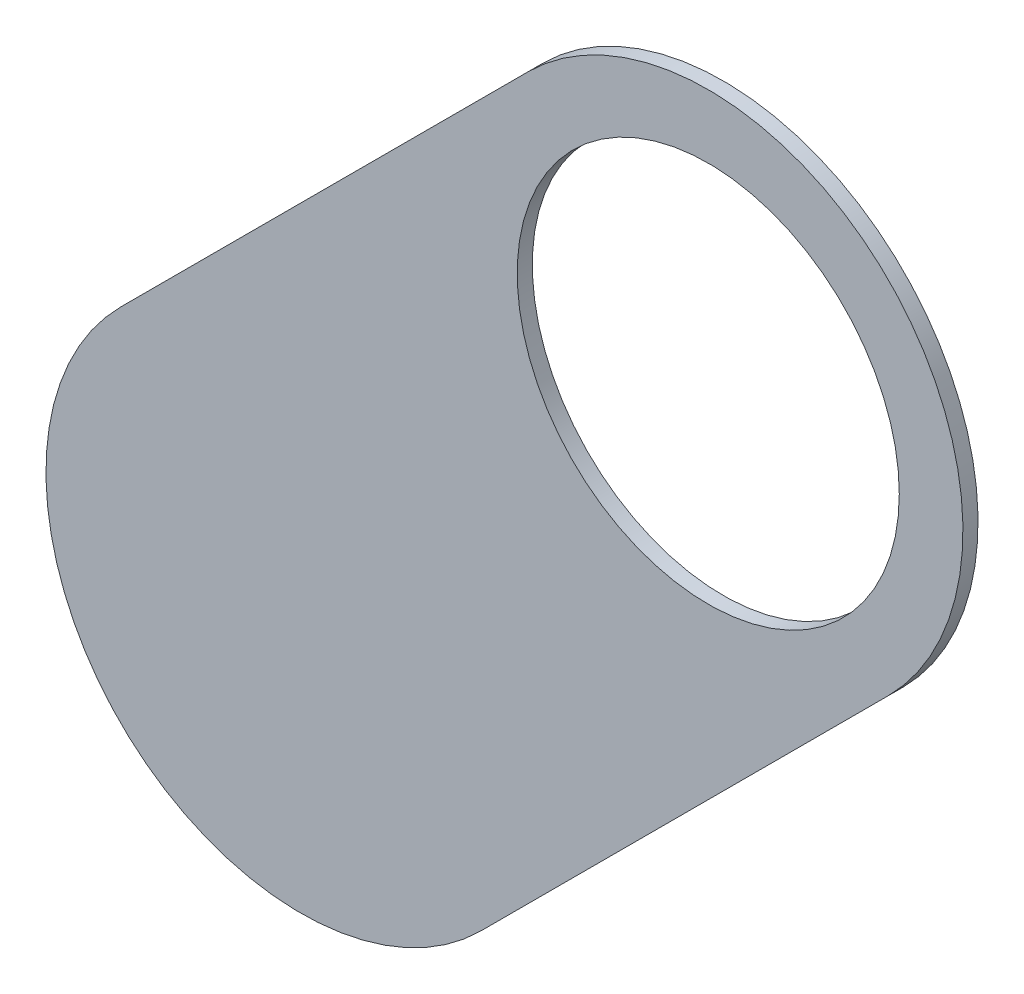
ISO-10303-21;
HEADER;
FILE_DESCRIPTION(('STEP AP214'),'2;1');
FILE_NAME('part.step','',(''),(''),'','','');
FILE_SCHEMA(('AUTOMOTIVE_DESIGN { 1 0 10303 214 1 1 1 1 }'));
ENDSEC;
DATA;
#1=APPLICATION_CONTEXT('core data for automotive mechanical design processes');
#2=APPLICATION_PROTOCOL_DEFINITION('international standard','automotive_design',2000,#1);
#3=PRODUCT_CONTEXT('',#1,'mechanical');
#4=PRODUCT('Part','Part','',(#3));
#5=PRODUCT_RELATED_PRODUCT_CATEGORY('part','',(#4));
#6=PRODUCT_DEFINITION_FORMATION('','',#4);
#7=PRODUCT_DEFINITION_CONTEXT('part definition',#1,'design');
#8=PRODUCT_DEFINITION('design','',#6,#7);
#9=PRODUCT_DEFINITION_SHAPE('','',#8);
#10=(LENGTH_UNIT() NAMED_UNIT(*) SI_UNIT(.MILLI.,.METRE.));
#11=(NAMED_UNIT(*) PLANE_ANGLE_UNIT() SI_UNIT($,.RADIAN.));
#12=(NAMED_UNIT(*) SI_UNIT($,.STERADIAN.) SOLID_ANGLE_UNIT());
#13=UNCERTAINTY_MEASURE_WITH_UNIT(LENGTH_MEASURE(1.E-05),#10,'distance_accuracy_value','');
#14=(GEOMETRIC_REPRESENTATION_CONTEXT(3) GLOBAL_UNCERTAINTY_ASSIGNED_CONTEXT((#13)) GLOBAL_UNIT_ASSIGNED_CONTEXT((#10,
#11,#12)) REPRESENTATION_CONTEXT('',''));
#15=CARTESIAN_POINT('',(0.,0.,0.));
#16=DIRECTION('',(0.,0.,1.));
#17=DIRECTION('',(1.,0.,0.));
#18=AXIS2_PLACEMENT_3D('',#15,#16,#17);
#19=CARTESIAN_POINT('',(105.86423582,42.07572738,0.));
#20=DIRECTION('',(-0.707106781186545,0.70710678118655,0.));
#21=DIRECTION('',(0.70710678118655,0.707106781186545,0.));
#22=AXIS2_PLACEMENT_3D('',#19,#20,#21);
#23=PLANE('',#22);
#24=DIRECTION('',(0.70710678118655,0.707106781186545,0.));
#25=VECTOR('',#24,1.);
#26=CARTESIAN_POINT('',(105.86423582,42.07572738,0.03556));
#27=LINE('',#26,#25);
#28=CARTESIAN_POINT('',(105.86423582,42.07572738,0.03556));
#29=VERTEX_POINT('',#28);
#30=CARTESIAN_POINT('',(106.82425422,43.03574578,0.03556));
#31=VERTEX_POINT('',#30);
#32=EDGE_CURVE('E11',#29,#31,#27,.T.);
#33=ORIENTED_EDGE('',*,*,#32,.F.);
#34=DIRECTION('',(0.,0.,1.));
#35=VECTOR('',#34,1.);
#36=CARTESIAN_POINT('',(105.86423582,42.07572738,0.));
#37=LINE('',#36,#35);
#38=CARTESIAN_POINT('',(105.86423582,42.07572738,0.));
#39=VERTEX_POINT('',#38);
#40=EDGE_CURVE('E24',#39,#29,#37,.T.);
#41=ORIENTED_EDGE('',*,*,#40,.F.);
#42=DIRECTION('',(0.70710678118655,0.707106781186545,0.));
#43=VECTOR('',#42,1.);
#44=CARTESIAN_POINT('',(105.86423582,42.07572738,0.));
#45=LINE('',#44,#43);
#46=CARTESIAN_POINT('',(106.82425422,43.03574578,0.));
#47=VERTEX_POINT('',#46);
#48=EDGE_CURVE('E96',#39,#47,#45,.T.);
#49=ORIENTED_EDGE('',*,*,#48,.T.);
#50=DIRECTION('',(0.,0.,1.));
#51=VECTOR('',#50,1.);
#52=CARTESIAN_POINT('',(106.82425422,43.03574578,0.));
#53=LINE('',#52,#51);
#54=EDGE_CURVE('E37',#47,#31,#53,.T.);
#55=ORIENTED_EDGE('',*,*,#54,.T.);
#56=EDGE_LOOP('',(#33,#41,#49,#55));
#57=FACE_BOUND('',#56,.T.);
#58=ADVANCED_FACE('F17',(#57),#23,.F.);
#59=CARTESIAN_POINT('',(105.439972,42.4999912,0.));
#60=DIRECTION('',(0.,0.,-1.));
#61=DIRECTION('',(-0.707106781186542,0.707106781186554,0.));
#62=AXIS2_PLACEMENT_3D('',#59,#60,#61);
#63=CYLINDRICAL_SURFACE('',#62,0.599999648268213);
#64=CARTESIAN_POINT('',(105.439972,42.4999912,0.03556));
#65=DIRECTION('',(0.,0.,1.));
#66=DIRECTION('',(-0.707106781186542,0.707106781186554,0.));
#67=AXIS2_PLACEMENT_3D('',#64,#65,#66);
#68=CIRCLE('',#67,0.599999648268213);
#69=CARTESIAN_POINT('',(105.01570818,42.92425502,0.03556));
#70=VERTEX_POINT('',#69);
#71=EDGE_CURVE('E92',#70,#29,#68,.T.);
#72=ORIENTED_EDGE('',*,*,#71,.F.);
#73=DIRECTION('',(0.,0.,1.));
#74=VECTOR('',#73,1.);
#75=CARTESIAN_POINT('',(105.01570818,42.92425502,0.));
#76=LINE('',#75,#74);
#77=CARTESIAN_POINT('',(105.01570818,42.92425502,0.));
#78=VERTEX_POINT('',#77);
#79=EDGE_CURVE('E90',#78,#70,#76,.T.);
#80=ORIENTED_EDGE('',*,*,#79,.F.);
#81=CARTESIAN_POINT('',(105.439972,42.4999912,0.));
#82=DIRECTION('',(0.,0.,1.));
#83=DIRECTION('',(-0.707106781186542,0.707106781186554,0.));
#84=AXIS2_PLACEMENT_3D('',#81,#82,#83);
#85=CIRCLE('',#84,0.599999648268213);
#86=EDGE_CURVE('E88',#78,#39,#85,.T.);
#87=ORIENTED_EDGE('',*,*,#86,.T.);
#88=ORIENTED_EDGE('',*,*,#40,.T.);
#89=EDGE_LOOP('',(#72,#80,#87,#88));
#90=FACE_BOUND('',#89,.T.);
#91=ADVANCED_FACE('F111',(#90),#63,.T.);
#92=CARTESIAN_POINT('',(106.3999904,43.4600096,0.));
#93=DIRECTION('',(0.,0.,-1.));
#94=DIRECTION('',(0.707106781186542,-0.707106781186554,0.));
#95=AXIS2_PLACEMENT_3D('',#92,#93,#94);
#96=CYLINDRICAL_SURFACE('',#95,0.599999648268216);
#97=CARTESIAN_POINT('',(106.3999904,43.4600096,0.03556));
#98=DIRECTION('',(0.,0.,1.));
#99=DIRECTION('',(0.707106781186542,-0.707106781186554,0.));
#100=AXIS2_PLACEMENT_3D('',#97,#98,#99);
#101=CIRCLE('',#100,0.599999648268216);
#102=CARTESIAN_POINT('',(105.97572658,43.88427342,0.03556));
#103=VERTEX_POINT('',#102);
#104=EDGE_CURVE('E85',#31,#103,#101,.T.);
#105=ORIENTED_EDGE('',*,*,#104,.F.);
#106=ORIENTED_EDGE('',*,*,#54,.F.);
#107=CARTESIAN_POINT('',(106.3999904,43.4600096,0.));
#108=DIRECTION('',(0.,0.,1.));
#109=DIRECTION('',(0.707106781186542,-0.707106781186554,0.));
#110=AXIS2_PLACEMENT_3D('',#107,#108,#109);
#111=CIRCLE('',#110,0.599999648268216);
#112=CARTESIAN_POINT('',(105.97572658,43.88427342,0.));
#113=VERTEX_POINT('',#112);
#114=EDGE_CURVE('E82',#47,#113,#111,.T.);
#115=ORIENTED_EDGE('',*,*,#114,.T.);
#116=DIRECTION('',(0.,0.,1.));
#117=VECTOR('',#116,1.);
#118=CARTESIAN_POINT('',(105.97572658,43.88427342,0.));
#119=LINE('',#118,#117);
#120=EDGE_CURVE('E80',#113,#103,#119,.T.);
#121=ORIENTED_EDGE('',*,*,#120,.T.);
#122=EDGE_LOOP('',(#105,#106,#115,#121));
#123=FACE_BOUND('',#122,.T.);
#124=ADVANCED_FACE('F104',(#123),#96,.T.);
#125=CARTESIAN_POINT('',(105.97572658,43.88427342,0.));
#126=DIRECTION('',(0.70710678118655,-0.707106781186545,0.));
#127=DIRECTION('',(-0.707106781186545,-0.70710678118655,0.));
#128=AXIS2_PLACEMENT_3D('',#125,#126,#127);
#129=PLANE('',#128);
#130=DIRECTION('',(-0.707106781186545,-0.70710678118655,0.));
#131=VECTOR('',#130,1.);
#132=CARTESIAN_POINT('',(105.97572658,43.88427342,0.03556));
#133=LINE('',#132,#131);
#134=EDGE_CURVE('E77',#103,#70,#133,.T.);
#135=ORIENTED_EDGE('',*,*,#134,.F.);
#136=ORIENTED_EDGE('',*,*,#120,.F.);
#137=DIRECTION('',(-0.707106781186545,-0.70710678118655,0.));
#138=VECTOR('',#137,1.);
#139=CARTESIAN_POINT('',(105.97572658,43.88427342,0.));
#140=LINE('',#139,#138);
#141=EDGE_CURVE('E68',#113,#78,#140,.T.);
#142=ORIENTED_EDGE('',*,*,#141,.T.);
#143=ORIENTED_EDGE('',*,*,#79,.T.);
#144=EDGE_LOOP('',(#135,#136,#142,#143));
#145=FACE_BOUND('',#144,.T.);
#146=ADVANCED_FACE('F110',(#145),#129,.F.);
#147=CARTESIAN_POINT('',(106.3999904,43.4600096,0.));
#148=DIRECTION('',(0.,0.,-1.));
#149=DIRECTION('',(1.,0.,0.));
#150=AXIS2_PLACEMENT_3D('',#147,#148,#149);
#151=CYLINDRICAL_SURFACE('',#150,0.4499991);
#152=DIRECTION('',(0.,0.,1.));
#153=VECTOR('',#152,1.);
#154=CARTESIAN_POINT('',(106.8499895,43.4600096,0.));
#155=LINE('',#154,#153);
#156=CARTESIAN_POINT('',(106.8499895,43.4600096,0.));
#157=VERTEX_POINT('',#156);
#158=CARTESIAN_POINT('',(106.8499895,43.4600096,0.03556));
#159=VERTEX_POINT('',#158);
#160=EDGE_CURVE('E62',#157,#159,#155,.T.);
#161=ORIENTED_EDGE('',*,*,#160,.T.);
#162=CARTESIAN_POINT('',(106.3999904,43.4600096,0.03556));
#163=DIRECTION('',(0.,0.,1.));
#164=DIRECTION('',(1.,0.,0.));
#165=AXIS2_PLACEMENT_3D('',#162,#163,#164);
#166=CIRCLE('',#165,0.4499991);
#167=EDGE_CURVE('E67',#159,#159,#166,.T.);
#168=ORIENTED_EDGE('',*,*,#167,.T.);
#169=ORIENTED_EDGE('',*,*,#160,.F.);
#170=CARTESIAN_POINT('',(106.3999904,43.4600096,0.));
#171=DIRECTION('',(0.,0.,1.));
#172=DIRECTION('',(1.,0.,0.));
#173=AXIS2_PLACEMENT_3D('',#170,#171,#172);
#174=CIRCLE('',#173,0.4499991);
#175=EDGE_CURVE('E65',#157,#157,#174,.T.);
#176=ORIENTED_EDGE('',*,*,#175,.F.);
#177=EDGE_LOOP('',(#161,#168,#169,#176));
#178=FACE_BOUND('',#177,.T.);
#179=ADVANCED_FACE('F64',(#178),#151,.F.);
#180=CARTESIAN_POINT('',(105.86423582,42.07572738,0.));
#181=DIRECTION('',(0.,0.,-1.));
#182=DIRECTION('',(-1.,0.,0.));
#183=AXIS2_PLACEMENT_3D('',#180,#181,#182);
#184=PLANE('',#183);
#185=ORIENTED_EDGE('',*,*,#48,.F.);
#186=ORIENTED_EDGE('',*,*,#86,.F.);
#187=ORIENTED_EDGE('',*,*,#141,.F.);
#188=ORIENTED_EDGE('',*,*,#114,.F.);
#189=EDGE_LOOP('',(#185,#186,#187,#188));
#190=FACE_BOUND('',#189,.T.);
#191=ORIENTED_EDGE('',*,*,#175,.T.);
#192=EDGE_LOOP('',(#191));
#193=FACE_BOUND('',#192,.T.);
#194=ADVANCED_FACE('F71',(#190,#193),#184,.T.);
#195=CARTESIAN_POINT('',(105.86423582,42.07572738,0.03556));
#196=DIRECTION('',(0.,0.,-1.));
#197=DIRECTION('',(-1.,0.,0.));
#198=AXIS2_PLACEMENT_3D('',#195,#196,#197);
#199=PLANE('',#198);
#200=ORIENTED_EDGE('',*,*,#134,.T.);
#201=ORIENTED_EDGE('',*,*,#71,.T.);
#202=ORIENTED_EDGE('',*,*,#32,.T.);
#203=ORIENTED_EDGE('',*,*,#104,.T.);
#204=EDGE_LOOP('',(#200,#201,#202,#203));
#205=FACE_BOUND('',#204,.T.);
#206=ORIENTED_EDGE('',*,*,#167,.F.);
#207=EDGE_LOOP('',(#206));
#208=FACE_BOUND('',#207,.T.);
#209=ADVANCED_FACE('F107',(#205,#208),#199,.F.);
#210=CLOSED_SHELL('',(#58,#91,#124,#146,#179,#194,#209));
#211=MANIFOLD_SOLID_BREP('B1',#210);
#212=ADVANCED_BREP_SHAPE_REPRESENTATION('',(#18,#211),#14);
#213=SHAPE_DEFINITION_REPRESENTATION(#9,#212);
ENDSEC;
END-ISO-10303-21;
